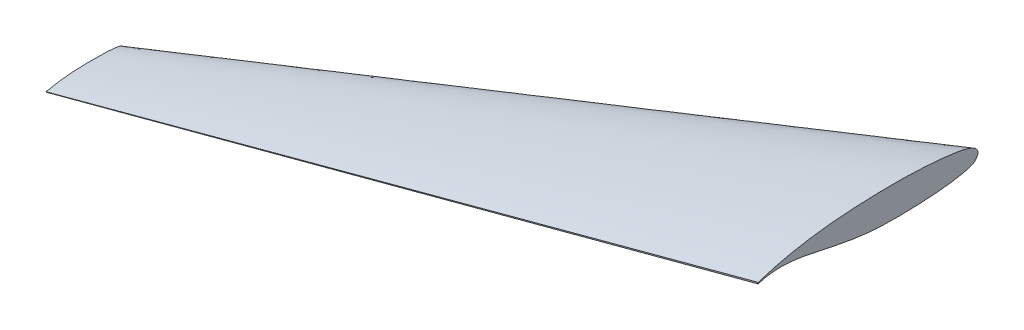
ISO-10303-21;
HEADER;
FILE_DESCRIPTION(('STEP AP214'),'2;1');
FILE_NAME('part.step','',(''),(''),'','','');
FILE_SCHEMA(('AUTOMOTIVE_DESIGN { 1 0 10303 214 1 1 1 1 }'));
ENDSEC;
DATA;
#1=APPLICATION_CONTEXT('core data for automotive mechanical design processes');
#2=APPLICATION_PROTOCOL_DEFINITION('international standard','automotive_design',2000,#1);
#3=PRODUCT_CONTEXT('',#1,'mechanical');
#4=PRODUCT('Part','Part','',(#3));
#5=PRODUCT_RELATED_PRODUCT_CATEGORY('part','',(#4));
#6=PRODUCT_DEFINITION_FORMATION('','',#4);
#7=PRODUCT_DEFINITION_CONTEXT('part definition',#1,'design');
#8=PRODUCT_DEFINITION('design','',#6,#7);
#9=PRODUCT_DEFINITION_SHAPE('','',#8);
#10=(LENGTH_UNIT() NAMED_UNIT(*) SI_UNIT(.MILLI.,.METRE.));
#11=(NAMED_UNIT(*) PLANE_ANGLE_UNIT() SI_UNIT($,.RADIAN.));
#12=(NAMED_UNIT(*) SI_UNIT($,.STERADIAN.) SOLID_ANGLE_UNIT());
#13=UNCERTAINTY_MEASURE_WITH_UNIT(LENGTH_MEASURE(1.E-05),#10,'distance_accuracy_value','');
#14=(GEOMETRIC_REPRESENTATION_CONTEXT(3) GLOBAL_UNCERTAINTY_ASSIGNED_CONTEXT((#13)) GLOBAL_UNIT_ASSIGNED_CONTEXT((#10,
#11,#12)) REPRESENTATION_CONTEXT('',''));
#15=CARTESIAN_POINT('',(0.,0.,0.));
#16=DIRECTION('',(0.,0.,1.));
#17=DIRECTION('',(1.,0.,0.));
#18=AXIS2_PLACEMENT_3D('',#15,#16,#17);
#19=CARTESIAN_POINT('',(-17711.940475464,-15.8130514374712,14068.2664031076));
#20=DIRECTION('',(-1.,0.,0.));
#21=DIRECTION('',(0.,0.00602622616138376,-0.999981842134272));
#22=AXIS2_PLACEMENT_3D('',#19,#20,#21);
#23=PLANE('',#22);
#24=CARTESIAN_POINT('',(-17711.940475464,-15.8130514374712,14068.2664031076));
#25=CARTESIAN_POINT('',(-17711.940475464,41.3944573956827,13808.8497174991));
#26=CARTESIAN_POINT('',(-17711.940475464,81.3294975090124,13545.1127401605));
#27=CARTESIAN_POINT('',(-17711.940475464,118.313912795888,13108.497152444));
#28=CARTESIAN_POINT('',(-17711.940475464,125.638180271525,12933.165113035));
#29=CARTESIAN_POINT('',(-17711.940475464,132.289914098428,12587.9188844221));
#30=CARTESIAN_POINT('',(-17711.940475464,131.845992853705,12409.687296129));
#31=CARTESIAN_POINT('',(-17711.940475464,126.798865744636,12067.3135180284));
#32=CARTESIAN_POINT('',(-17711.940475464,122.008531395881,11888.0995964154));
#33=CARTESIAN_POINT('',(-17711.940475464,95.2060162132103,11687.3207423543));
#34=CARTESIAN_POINT('',(-17711.940475464,87.4335696718086,11636.5027445196));
#35=CARTESIAN_POINT('',(-17711.940475464,82.8166994266646,11592.776350498));
#36=CARTESIAN_POINT('',(-17711.940475464,62.8941371107513,11520.2820314438));
#37=CARTESIAN_POINT('',(-17711.940475464,22.8509522508046,11449.683428606));
#38=CARTESIAN_POINT('',(-17711.940475464,0.,11444.2752214398));
#39=B_SPLINE_CURVE_WITH_KNOTS('',3,(#24,#25,#26,#27,#28,#29,#30,#31,#32,#33,#34,#35,#36,#37,
#38),.UNSPECIFIED.,.F.,.F.,(4,1,1,1,1,1,1,1,1,1,1,1,4),(0.,0.300306214195935,0.300506353245141,
0.495240719052951,0.498599859365835,0.690406647851814,0.696246131860642,0.886629083789051,
0.894559473605489,0.922025719723024,0.94363650923235,0.948318104073382,1.),.UNSPECIFIED.);
#40=CARTESIAN_POINT('',(-17711.940475464,0.,11444.2752214398));
#41=VERTEX_POINT('',#40);
#42=CARTESIAN_POINT('',(-17711.940475464,-15.8130514374712,14068.2664031076));
#43=VERTEX_POINT('',#42);
#44=EDGE_CURVE('E113',#41,#43,#39,.F.);
#45=ORIENTED_EDGE('',*,*,#44,.F.);
#46=CARTESIAN_POINT('',(-17711.940475464,0.,11444.2752214398));
#47=CARTESIAN_POINT('',(-17711.940475464,-47.818557129653,11446.9972277219));
#48=CARTESIAN_POINT('',(-17711.940475464,-63.0903884514529,11514.9937546275));
#49=CARTESIAN_POINT('',(-17711.940475464,-78.3886634121315,11590.3487551736));
#50=CARTESIAN_POINT('',(-17711.940475464,-86.6397036490906,11634.4554990894));
#51=CARTESIAN_POINT('',(-17711.940475464,-93.2729643868783,11685.3168945833));
#52=CARTESIAN_POINT('',(-17711.940475464,-116.962708154297,11886.0989316644));
#53=CARTESIAN_POINT('',(-17711.940475464,-124.768790117039,12064.06661987));
#54=CARTESIAN_POINT('',(-17711.940475464,-131.747537065342,12408.7396195625));
#55=CARTESIAN_POINT('',(-17711.940475464,-131.076895392797,12585.9621770555));
#56=CARTESIAN_POINT('',(-17711.940475464,-110.923731359257,12933.1723140875));
#57=CARTESIAN_POINT('',(-17711.940475464,-90.8918341756138,13109.5736224428));
#58=CARTESIAN_POINT('',(-17711.940475464,-48.2087782371968,13368.8391971416));
#59=CARTESIAN_POINT('',(-17711.940475464,1.18684815978902,13628.6530130911));
#60=CARTESIAN_POINT('',(-17711.940475464,11.6483985730418,13895.1026446759));
#61=CARTESIAN_POINT('',(-17711.940475464,-29.3719819061615,14068.2664031076));
#62=B_SPLINE_CURVE_WITH_KNOTS('',3,(#46,#47,#48,#49,#50,#51,#52,#53,#54,#55,#56,#57,#58,#59,#60,
#61),.UNSPECIFIED.,.F.,.F.,(4,1,1,1,1,1,1,1,1,1,1,1,1,4),(0.,0.0546217915879629,
0.0568022946260039,0.0808417609968839,0.108219422965478,0.113833768892824,0.306383441939405,
0.310212468355379,0.503114766214556,0.50559428152025,0.701848021766534,0.702801294739028,
0.801775017183419,1.),.UNSPECIFIED.);
#63=CARTESIAN_POINT('',(-17711.940475464,-29.3719819061615,14068.2664031076));
#64=VERTEX_POINT('',#63);
#65=EDGE_CURVE('E76',#64,#41,#62,.F.);
#66=ORIENTED_EDGE('',*,*,#65,.F.);
#67=DIRECTION('',(0.,-1.,0.));
#68=VECTOR('',#67,1.);
#69=CARTESIAN_POINT('',(-17711.940475464,-15.8130514374713,14068.2664031076));
#70=LINE('',#69,#68);
#71=EDGE_CURVE('E64',#43,#64,#70,.T.);
#72=ORIENTED_EDGE('',*,*,#71,.F.);
#73=EDGE_LOOP('',(#45,#66,#72));
#74=FACE_BOUND('',#73,.T.);
#75=ADVANCED_FACE('F61',(#74),#23,.T.);
#76=CARTESIAN_POINT('',(0.,0.,0.));
#77=DIRECTION('',(-1.,0.,0.));
#78=DIRECTION('',(0.,-0.0162840972649137,0.999867405297456));
#79=AXIS2_PLACEMENT_3D('',#76,#77,#78);
#80=PLANE('',#79);
#81=CARTESIAN_POINT('',(0.,0.,0.));
#82=CARTESIAN_POINT('',(0.,-177.788302382174,25.8204081020493));
#83=CARTESIAN_POINT('',(0.,-246.485948710704,171.085912968349));
#84=CARTESIAN_POINT('',(0.,-311.912015004825,377.44430817759));
#85=CARTESIAN_POINT('',(0.,-347.09591396304,511.99499932436));
#86=CARTESIAN_POINT('',(0.,-373.198588527806,653.061349223909));
#87=CARTESIAN_POINT('',(0.,-464.310856576101,1213.16292025647));
#88=CARTESIAN_POINT('',(0.,-499.101668502809,1735.12009555467));
#89=CARTESIAN_POINT('',(0.,-531.724252638484,2737.33294474881));
#90=CARTESIAN_POINT('',(0.,-531.33000610697,3247.87374350738));
#91=CARTESIAN_POINT('',(0.,-434.932009966432,4240.80242948856));
#92=CARTESIAN_POINT('',(0.,-335.773317959958,4741.45289985921));
#93=CARTESIAN_POINT('',(0.,-174.510415982621,5488.4887692628));
#94=CARTESIAN_POINT('',(0.,-5.08441114977858,6242.80148239056));
#95=CARTESIAN_POINT('',(0.,37.3131454345689,6997.03429239929));
#96=CARTESIAN_POINT('',(0.,-122.099983023939,7497.11766190782));
#97=B_SPLINE_CURVE_WITH_KNOTS('',3,(#81,#82,#83,#84,#85,#86,#87,#88,#89,#90,#91,#92,#93,#94,#95,
#96),.UNSPECIFIED.,.F.,.F.,(4,1,1,1,1,1,1,1,1,1,1,1,1,4),(0.,0.0546217915879629,
0.0568022946260039,0.0808417609968839,0.108219422965478,0.113833768892824,0.306383441939405,
0.310212468355379,0.503114766214556,0.50559428152025,0.701848021766534,0.702801294739028,
0.801775017183419,1.),.UNSPECIFIED.);
#98=CARTESIAN_POINT('',(0.,0.,0.));
#99=VERTEX_POINT('',#98);
#100=CARTESIAN_POINT('',(0.,-122.099983023939,7497.11766190782));
#101=VERTEX_POINT('',#100);
#102=EDGE_CURVE('E91',#99,#101,#97,.T.);
#103=ORIENTED_EDGE('',*,*,#102,.F.);
#104=CARTESIAN_POINT('',(0.,-75.5439842046241,7497.11766190782));
#105=CARTESIAN_POINT('',(0.,163.349577430584,6765.36319944543));
#106=CARTESIAN_POINT('',(0.,310.945987730007,6007.12013959609));
#107=CARTESIAN_POINT('',(0.,456.576748471813,4745.80468219487));
#108=CARTESIAN_POINT('',(0.,489.54342857293,4237.73844104663));
#109=CARTESIAN_POINT('',(0.,526.225751024995,3243.05682521399));
#110=CARTESIAN_POINT('',(0.,530.700398686078,2732.25624821552));
#111=CARTESIAN_POINT('',(0.,495.049999949291,1727.18986093902));
#112=CARTESIAN_POINT('',(0.,452.863049777549,1190.05088466301));
#113=CARTESIAN_POINT('',(0.,369.203265791287,644.119232099813));
#114=CARTESIAN_POINT('',(0.,344.239306000903,506.474796896507));
#115=CARTESIAN_POINT('',(0.,305.836809672672,368.0160442172));
#116=CARTESIAN_POINT('',(0.,232.571763355937,155.007504072364));
#117=CARTESIAN_POINT('',(0.,147.744350315997,-1.87596635575002));
#118=CARTESIAN_POINT('',(0.,0.,0.));
#119=B_SPLINE_CURVE_WITH_KNOTS('',3,(#104,#105,#106,#107,#108,#109,#110,#111,#112,#113,#114,
#115,#116,#117,#118),.UNSPECIFIED.,.F.,.F.,(4,1,1,1,1,1,1,1,1,1,1,1,4),(0.,0.300306214195935,
0.300506353245141,0.495240719052951,0.498599859365835,0.690406647851814,0.696246131860642,
0.886629083789051,0.894559473605489,0.922025719723024,0.94363650923235,0.948318104073382,1.),.UNSPECIFIED.);
#120=CARTESIAN_POINT('',(0.,-75.5439842046241,7497.11766190782));
#121=VERTEX_POINT('',#120);
#122=EDGE_CURVE('E94',#121,#99,#119,.T.);
#123=ORIENTED_EDGE('',*,*,#122,.F.);
#124=DIRECTION('',(0.,-1.,0.));
#125=VECTOR('',#124,1.);
#126=CARTESIAN_POINT('',(0.,-75.5439842046226,7497.11766190782));
#127=LINE('',#126,#125);
#128=EDGE_CURVE('E12',#121,#101,#127,.T.);
#129=ORIENTED_EDGE('',*,*,#128,.T.);
#130=EDGE_LOOP('',(#103,#123,#129));
#131=FACE_BOUND('',#130,.T.);
#132=ADVANCED_FACE('F93',(#131),#80,.F.);
#133=CARTESIAN_POINT('',(2444.91600832248,0.,6590.05122428721));
#134=DIRECTION('',(0.34783428390117,0.,0.937556030828537));
#135=DIRECTION('',(0.937556030828537,0.,-0.34783428390117));
#136=AXIS2_PLACEMENT_3D('',#133,#134,#135);
#137=PLANE('',#136);
#138=DIRECTION('',(0.937551344586137,-0.00316175499837554,-0.347832545300259));
#139=VECTOR('',#138,1.);
#140=CARTESIAN_POINT('',(-8855.970237732,-45.6785178210476,10782.6920325077));
#141=LINE('',#140,#139);
#142=EDGE_CURVE('E109',#43,#121,#141,.T.);
#143=ORIENTED_EDGE('',*,*,#142,.F.);
#144=ORIENTED_EDGE('',*,*,#71,.T.);
#145=DIRECTION('',(-0.937544736943559,0.00490836391053259,0.34783009385784));
#146=VECTOR('',#145,1.);
#147=CARTESIAN_POINT('',(-8855.970237732,-75.7359824650503,10782.6920325077));
#148=LINE('',#147,#146);
#149=EDGE_CURVE('E100',#101,#64,#148,.T.);
#150=ORIENTED_EDGE('',*,*,#149,.F.);
#151=ORIENTED_EDGE('',*,*,#128,.F.);
#152=EDGE_LOOP('',(#143,#144,#150,#151));
#153=FACE_BOUND('',#152,.T.);
#154=ADVANCED_FACE('F134',(#153),#137,.T.);
#155=CARTESIAN_POINT('',(0.,0.,0.));
#156=CARTESIAN_POINT('',(-17711.940475464,0.,11444.2752214398));
#157=CARTESIAN_POINT('',(0.,-177.788302382174,25.8204081020493));
#158=CARTESIAN_POINT('',(-17711.940475464,-47.818557129653,11446.9972277219));
#159=CARTESIAN_POINT('',(0.,-246.485948710704,171.085912968349));
#160=CARTESIAN_POINT('',(-17711.940475464,-63.0903884514529,11514.9937546275));
#161=CARTESIAN_POINT('',(0.,-311.912015004825,377.44430817759));
#162=CARTESIAN_POINT('',(-17711.940475464,-78.3886634121315,11590.3487551736));
#163=CARTESIAN_POINT('',(0.,-347.09591396304,511.99499932436));
#164=CARTESIAN_POINT('',(-17711.940475464,-86.6397036490906,11634.4554990894));
#165=CARTESIAN_POINT('',(0.,-373.198588527806,653.061349223909));
#166=CARTESIAN_POINT('',(-17711.940475464,-93.2729643868783,11685.3168945833));
#167=CARTESIAN_POINT('',(0.,-464.310856576101,1213.16292025647));
#168=CARTESIAN_POINT('',(-17711.940475464,-116.962708154297,11886.0989316644));
#169=CARTESIAN_POINT('',(0.,-499.101668502809,1735.12009555467));
#170=CARTESIAN_POINT('',(-17711.940475464,-124.768790117039,12064.06661987));
#171=CARTESIAN_POINT('',(0.,-531.724252638484,2737.33294474881));
#172=CARTESIAN_POINT('',(-17711.940475464,-131.747537065342,12408.7396195625));
#173=CARTESIAN_POINT('',(0.,-531.33000610697,3247.87374350738));
#174=CARTESIAN_POINT('',(-17711.940475464,-131.076895392797,12585.9621770555));
#175=CARTESIAN_POINT('',(0.,-434.932009966432,4240.80242948856));
#176=CARTESIAN_POINT('',(-17711.940475464,-110.923731359257,12933.1723140875));
#177=CARTESIAN_POINT('',(0.,-335.773317959958,4741.45289985921));
#178=CARTESIAN_POINT('',(-17711.940475464,-90.8918341756138,13109.5736224428));
#179=CARTESIAN_POINT('',(0.,-174.510415982621,5488.4887692628));
#180=CARTESIAN_POINT('',(-17711.940475464,-48.2087782371968,13368.8391971416));
#181=CARTESIAN_POINT('',(0.,-5.08441114977858,6242.80148239056));
#182=CARTESIAN_POINT('',(-17711.940475464,1.18684815978902,13628.6530130911));
#183=CARTESIAN_POINT('',(0.,37.3131454345689,6997.03429239929));
#184=CARTESIAN_POINT('',(-17711.940475464,11.6483985730418,13895.1026446759));
#185=CARTESIAN_POINT('',(0.,-122.099983023939,7497.11766190782));
#186=CARTESIAN_POINT('',(-17711.940475464,-29.3719819061615,14068.2664031076));
#187=B_SPLINE_SURFACE_WITH_KNOTS('',3,1,((#155,#156),(#157,#158),(#159,#160),(#161,#162),(#163,
#164),(#165,#166),(#167,#168),(#169,#170),(#171,#172),(#173,#174),(#175,#176),(#177,#178),(#179,
#180),(#181,#182),(#183,#184),(#185,#186)),.UNSPECIFIED.,.F.,.F.,.F.,(4,1,1,1,1,1,1,1,1,1,1,1,1,
4),(2,2),(0.,0.0546217915879629,0.0568022946260039,0.0808417609968839,0.108219422965478,
0.113833768892824,0.306383441939405,0.310212468355379,0.503114766214556,0.50559428152025,
0.701848021766534,0.702801294739028,0.801775017183419,1.),(0.,1.),.UNSPECIFIED.);
#188=DIRECTION('',(-0.83992452032518,0.,0.542703233965412));
#189=VECTOR('',#188,1.);
#190=CARTESIAN_POINT('',(-8855.970237732,0.,5722.13761071991));
#191=LINE('',#190,#189);
#192=EDGE_CURVE('E107',#99,#41,#191,.T.);
#193=ORIENTED_EDGE('',*,*,#102,.T.);
#194=ORIENTED_EDGE('',*,*,#149,.T.);
#195=ORIENTED_EDGE('',*,*,#65,.T.);
#196=ORIENTED_EDGE('',*,*,#192,.F.);
#197=EDGE_LOOP('',(#193,#194,#195,#196));
#198=FACE_BOUND('',#197,.T.);
#199=ADVANCED_FACE('F112',(#198),#187,.T.);
#200=CARTESIAN_POINT('',(0.,-75.5439842046241,7497.11766190782));
#201=CARTESIAN_POINT('',(-17711.940475464,-15.8130514374712,14068.2664031076));
#202=CARTESIAN_POINT('',(0.,163.349577430584,6765.36319944543));
#203=CARTESIAN_POINT('',(-17711.940475464,41.3944573956827,13808.8497174991));
#204=CARTESIAN_POINT('',(0.,310.945987730007,6007.12013959609));
#205=CARTESIAN_POINT('',(-17711.940475464,81.3294975090124,13545.1127401605));
#206=CARTESIAN_POINT('',(0.,456.576748471813,4745.80468219487));
#207=CARTESIAN_POINT('',(-17711.940475464,118.313912795888,13108.497152444));
#208=CARTESIAN_POINT('',(0.,489.54342857293,4237.73844104663));
#209=CARTESIAN_POINT('',(-17711.940475464,125.638180271525,12933.165113035));
#210=CARTESIAN_POINT('',(0.,526.225751024995,3243.05682521399));
#211=CARTESIAN_POINT('',(-17711.940475464,132.289914098428,12587.9188844221));
#212=CARTESIAN_POINT('',(0.,530.700398686078,2732.25624821552));
#213=CARTESIAN_POINT('',(-17711.940475464,131.845992853705,12409.687296129));
#214=CARTESIAN_POINT('',(0.,495.049999949291,1727.18986093902));
#215=CARTESIAN_POINT('',(-17711.940475464,126.798865744636,12067.3135180284));
#216=CARTESIAN_POINT('',(0.,452.863049777549,1190.05088466301));
#217=CARTESIAN_POINT('',(-17711.940475464,122.008531395881,11888.0995964154));
#218=CARTESIAN_POINT('',(0.,369.203265791287,644.119232099813));
#219=CARTESIAN_POINT('',(-17711.940475464,95.2060162132103,11687.3207423543));
#220=CARTESIAN_POINT('',(0.,344.239306000903,506.474796896507));
#221=CARTESIAN_POINT('',(-17711.940475464,87.4335696718086,11636.5027445196));
#222=CARTESIAN_POINT('',(0.,305.836809672672,368.0160442172));
#223=CARTESIAN_POINT('',(-17711.940475464,82.8166994266646,11592.776350498));
#224=CARTESIAN_POINT('',(0.,232.571763355937,155.007504072364));
#225=CARTESIAN_POINT('',(-17711.940475464,62.8941371107513,11520.2820314438));
#226=CARTESIAN_POINT('',(0.,147.744350315997,-1.87596635575002));
#227=CARTESIAN_POINT('',(-17711.940475464,22.8509522508046,11449.683428606));
#228=CARTESIAN_POINT('',(0.,0.,0.));
#229=CARTESIAN_POINT('',(-17711.940475464,0.,11444.2752214398));
#230=B_SPLINE_SURFACE_WITH_KNOTS('',3,1,((#200,#201),(#202,#203),(#204,#205),(#206,#207),(#208,
#209),(#210,#211),(#212,#213),(#214,#215),(#216,#217),(#218,#219),(#220,#221),(#222,#223),(#224,
#225),(#226,#227),(#228,#229)),.UNSPECIFIED.,.F.,.F.,.F.,(4,1,1,1,1,1,1,1,1,1,1,1,4),(2,2),(0.,
0.300306214195935,0.300506353245141,0.495240719052951,0.498599859365835,0.690406647851814,
0.696246131860642,0.886629083789051,0.894559473605489,0.922025719723024,0.94363650923235,
0.948318104073382,1.),(0.,1.),.UNSPECIFIED.);
#231=ORIENTED_EDGE('',*,*,#122,.T.);
#232=ORIENTED_EDGE('',*,*,#192,.T.);
#233=ORIENTED_EDGE('',*,*,#44,.T.);
#234=ORIENTED_EDGE('',*,*,#142,.T.);
#235=EDGE_LOOP('',(#231,#232,#233,#234));
#236=FACE_BOUND('',#235,.T.);
#237=ADVANCED_FACE('F105',(#236),#230,.T.);
#238=CLOSED_SHELL('',(#75,#132,#154,#199,#237));
#239=MANIFOLD_SOLID_BREP('B2',#238);
#240=ADVANCED_BREP_SHAPE_REPRESENTATION('',(#18,#239),#14);
#241=SHAPE_DEFINITION_REPRESENTATION(#9,#240);
ENDSEC;
END-ISO-10303-21;
